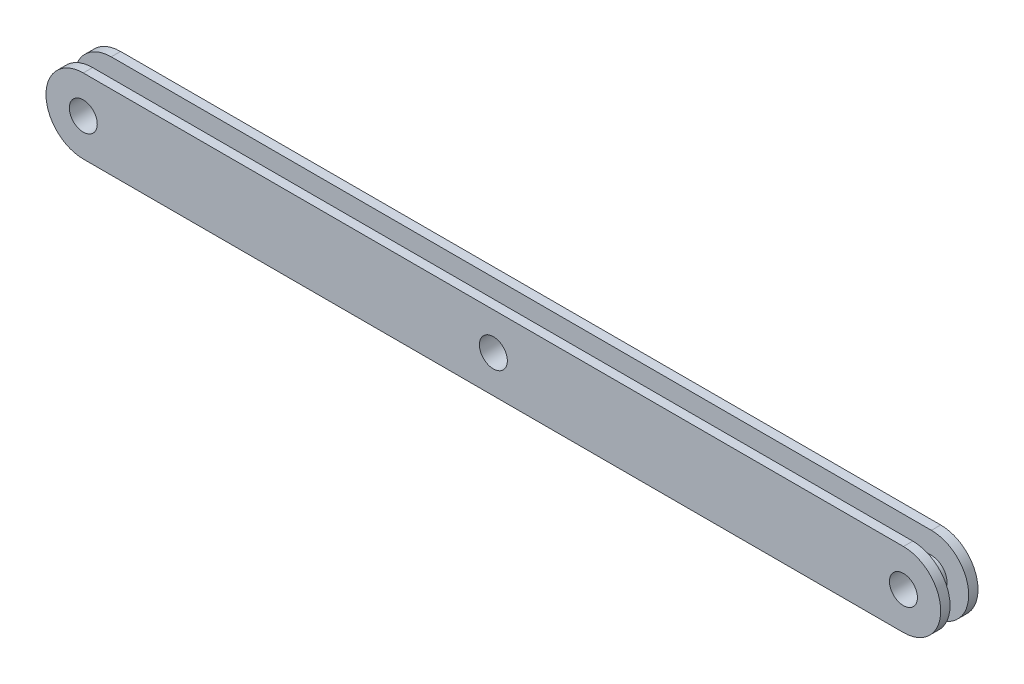
ISO-10303-21;
HEADER;
FILE_DESCRIPTION(('STEP AP214'),'2;1');
FILE_NAME('part.step','',(''),(''),'','','');
FILE_SCHEMA(('AUTOMOTIVE_DESIGN { 1 0 10303 214 1 1 1 1 }'));
ENDSEC;
DATA;
#1=APPLICATION_CONTEXT('core data for automotive mechanical design processes');
#2=APPLICATION_PROTOCOL_DEFINITION('international standard','automotive_design',2000,#1);
#3=PRODUCT_CONTEXT('',#1,'mechanical');
#4=PRODUCT('Part','Part','',(#3));
#5=PRODUCT_RELATED_PRODUCT_CATEGORY('part','',(#4));
#6=PRODUCT_DEFINITION_FORMATION('','',#4);
#7=PRODUCT_DEFINITION_CONTEXT('part definition',#1,'design');
#8=PRODUCT_DEFINITION('design','',#6,#7);
#9=PRODUCT_DEFINITION_SHAPE('','',#8);
#10=(LENGTH_UNIT() NAMED_UNIT(*) SI_UNIT(.MILLI.,.METRE.));
#11=(NAMED_UNIT(*) PLANE_ANGLE_UNIT() SI_UNIT($,.RADIAN.));
#12=(NAMED_UNIT(*) SI_UNIT($,.STERADIAN.) SOLID_ANGLE_UNIT());
#13=UNCERTAINTY_MEASURE_WITH_UNIT(LENGTH_MEASURE(1.E-05),#10,'distance_accuracy_value','');
#14=(GEOMETRIC_REPRESENTATION_CONTEXT(3) GLOBAL_UNCERTAINTY_ASSIGNED_CONTEXT((#13)) GLOBAL_UNIT_ASSIGNED_CONTEXT((#10,
#11,#12)) REPRESENTATION_CONTEXT('',''));
#15=CARTESIAN_POINT('',(0.,0.,0.));
#16=DIRECTION('',(0.,0.,1.));
#17=DIRECTION('',(1.,0.,0.));
#18=AXIS2_PLACEMENT_3D('',#15,#16,#17);
#19=CARTESIAN_POINT('',(0.,0.,-6.35));
#20=DIRECTION('',(0.,-1.,0.));
#21=DIRECTION('',(1.,0.,0.));
#22=AXIS2_PLACEMENT_3D('',#19,#20,#21);
#23=PLANE('',#22);
#24=DIRECTION('',(0.,0.,1.));
#25=VECTOR('',#24,1.);
#26=CARTESIAN_POINT('',(-146.05,0.,-6.35));
#27=LINE('',#26,#25);
#28=CARTESIAN_POINT('',(-146.05,0.,-1.5875));
#29=VERTEX_POINT('',#28);
#30=CARTESIAN_POINT('',(-146.05,0.,0.));
#31=VERTEX_POINT('',#30);
#32=EDGE_CURVE('E138',#29,#31,#27,.T.);
#33=ORIENTED_EDGE('',*,*,#32,.F.);
#34=DIRECTION('',(1.,0.,0.));
#35=VECTOR('',#34,1.);
#36=CARTESIAN_POINT('',(-152.4,0.,-1.5875));
#37=LINE('',#36,#35);
#38=CARTESIAN_POINT('',(-6.35000000000005,0.,-1.5875));
#39=VERTEX_POINT('',#38);
#40=EDGE_CURVE('E226',#29,#39,#37,.T.);
#41=ORIENTED_EDGE('',*,*,#40,.T.);
#42=DIRECTION('',(0.,0.,1.));
#43=VECTOR('',#42,1.);
#44=CARTESIAN_POINT('',(-6.34999999999999,0.,-6.35));
#45=LINE('',#44,#43);
#46=CARTESIAN_POINT('',(-6.34999999999999,0.,0.));
#47=VERTEX_POINT('',#46);
#48=EDGE_CURVE('E290',#39,#47,#45,.T.);
#49=ORIENTED_EDGE('',*,*,#48,.T.);
#50=DIRECTION('',(1.,0.,0.));
#51=VECTOR('',#50,1.);
#52=CARTESIAN_POINT('',(0.,0.,0.));
#53=LINE('',#52,#51);
#54=EDGE_CURVE('E275',#31,#47,#53,.T.);
#55=ORIENTED_EDGE('',*,*,#54,.F.);
#56=EDGE_LOOP('',(#33,#41,#49,#55));
#57=FACE_BOUND('',#56,.T.);
#58=ADVANCED_FACE('F123',(#57),#23,.T.);
#59=CARTESIAN_POINT('',(-6.34999999999999,0.,-6.35));
#60=VERTEX_POINT('',#59);
#61=CARTESIAN_POINT('',(-6.35000000000005,0.,-4.76249999999999));
#62=VERTEX_POINT('',#61);
#63=EDGE_CURVE('E222',#60,#62,#45,.T.);
#64=ORIENTED_EDGE('',*,*,#63,.T.);
#65=DIRECTION('',(1.,0.,0.));
#66=VECTOR('',#65,1.);
#67=CARTESIAN_POINT('',(-152.4,0.,-4.76249999999999));
#68=LINE('',#67,#66);
#69=CARTESIAN_POINT('',(-146.05,0.,-4.76249999999999));
#70=VERTEX_POINT('',#69);
#71=EDGE_CURVE('E214',#70,#62,#68,.T.);
#72=ORIENTED_EDGE('',*,*,#71,.F.);
#73=CARTESIAN_POINT('',(-146.05,0.,-6.35));
#74=VERTEX_POINT('',#73);
#75=EDGE_CURVE('E219',#74,#70,#27,.T.);
#76=ORIENTED_EDGE('',*,*,#75,.F.);
#77=DIRECTION('',(1.,0.,0.));
#78=VECTOR('',#77,1.);
#79=CARTESIAN_POINT('',(0.,0.,-6.35));
#80=LINE('',#79,#78);
#81=EDGE_CURVE('E274',#74,#60,#80,.T.);
#82=ORIENTED_EDGE('',*,*,#81,.T.);
#83=EDGE_LOOP('',(#64,#72,#76,#82));
#84=FACE_BOUND('',#83,.T.);
#85=ADVANCED_FACE('F216',(#84),#23,.T.);
#86=CARTESIAN_POINT('',(-152.4,12.7,-6.35));
#87=DIRECTION('',(0.,1.,0.));
#88=DIRECTION('',(-1.,0.,0.));
#89=AXIS2_PLACEMENT_3D('',#86,#87,#88);
#90=PLANE('',#89);
#91=DIRECTION('',(1.,0.,0.));
#92=VECTOR('',#91,1.);
#93=CARTESIAN_POINT('',(-152.4,12.7,-1.5875));
#94=LINE('',#93,#92);
#95=CARTESIAN_POINT('',(-146.05,12.7,-1.5875));
#96=VERTEX_POINT('',#95);
#97=CARTESIAN_POINT('',(-6.35000000000008,12.7,-1.5875));
#98=VERTEX_POINT('',#97);
#99=EDGE_CURVE('E286',#96,#98,#94,.T.);
#100=ORIENTED_EDGE('',*,*,#99,.F.);
#101=DIRECTION('',(0.,0.,1.));
#102=VECTOR('',#101,1.);
#103=CARTESIAN_POINT('',(-146.05,12.7,-6.35));
#104=LINE('',#103,#102);
#105=CARTESIAN_POINT('',(-146.05,12.7,0.));
#106=VERTEX_POINT('',#105);
#107=EDGE_CURVE('E295',#96,#106,#104,.T.);
#108=ORIENTED_EDGE('',*,*,#107,.T.);
#109=DIRECTION('',(-1.,0.,0.));
#110=VECTOR('',#109,1.);
#111=CARTESIAN_POINT('',(-152.4,12.7,0.));
#112=LINE('',#111,#110);
#113=CARTESIAN_POINT('',(-6.35,12.7,0.));
#114=VERTEX_POINT('',#113);
#115=EDGE_CURVE('E251',#114,#106,#112,.T.);
#116=ORIENTED_EDGE('',*,*,#115,.F.);
#117=DIRECTION('',(0.,0.,1.));
#118=VECTOR('',#117,1.);
#119=CARTESIAN_POINT('',(-6.35,12.7,-6.35));
#120=LINE('',#119,#118);
#121=EDGE_CURVE('E146',#98,#114,#120,.T.);
#122=ORIENTED_EDGE('',*,*,#121,.F.);
#123=EDGE_LOOP('',(#100,#108,#116,#122));
#124=FACE_BOUND('',#123,.T.);
#125=ADVANCED_FACE('F365',(#124),#90,.T.);
#126=CARTESIAN_POINT('',(-6.35,6.34999999999998,-6.35));
#127=DIRECTION('',(0.,0.,1.));
#128=DIRECTION('',(1.,0.,0.));
#129=AXIS2_PLACEMENT_3D('',#126,#127,#128);
#130=CYLINDRICAL_SURFACE('',#129,6.35);
#131=CARTESIAN_POINT('',(-6.35,6.34999999999998,-4.7625));
#132=DIRECTION('',(0.,0.,1.));
#133=DIRECTION('',(1.,0.,0.));
#134=AXIS2_PLACEMENT_3D('',#131,#132,#133);
#135=CIRCLE('',#134,6.35);
#136=CARTESIAN_POINT('',(-6.35000000000008,12.7,-4.76249999999999));
#137=VERTEX_POINT('',#136);
#138=EDGE_CURVE('E12',#62,#137,#135,.T.);
#139=ORIENTED_EDGE('',*,*,#138,.F.);
#140=ORIENTED_EDGE('',*,*,#63,.F.);
#141=CARTESIAN_POINT('',(-6.35,6.34999999999998,-6.35));
#142=DIRECTION('',(0.,0.,1.));
#143=DIRECTION('',(1.,0.,0.));
#144=AXIS2_PLACEMENT_3D('',#141,#142,#143);
#145=CIRCLE('',#144,6.35);
#146=CARTESIAN_POINT('',(-6.35,12.7,-6.35));
#147=VERTEX_POINT('',#146);
#148=EDGE_CURVE('E242',#147,#60,#145,.F.);
#149=ORIENTED_EDGE('',*,*,#148,.F.);
#150=EDGE_CURVE('E257',#147,#137,#120,.T.);
#151=ORIENTED_EDGE('',*,*,#150,.T.);
#152=EDGE_LOOP('',(#139,#140,#149,#151));
#153=FACE_BOUND('',#152,.T.);
#154=ADVANCED_FACE('F383',(#153),#130,.T.);
#155=CARTESIAN_POINT('',(-6.35,6.34999999999998,-1.5875));
#156=DIRECTION('',(0.,0.,-1.));
#157=DIRECTION('',(-1.,0.,0.));
#158=AXIS2_PLACEMENT_3D('',#155,#156,#157);
#159=CIRCLE('',#158,6.35);
#160=EDGE_CURVE('E131',#98,#39,#159,.T.);
#161=ORIENTED_EDGE('',*,*,#160,.F.);
#162=ORIENTED_EDGE('',*,*,#121,.T.);
#163=CARTESIAN_POINT('',(-6.35,6.34999999999998,0.));
#164=DIRECTION('',(0.,0.,1.));
#165=DIRECTION('',(1.,0.,0.));
#166=AXIS2_PLACEMENT_3D('',#163,#164,#165);
#167=CIRCLE('',#166,6.35);
#168=EDGE_CURVE('E240',#114,#47,#167,.F.);
#169=ORIENTED_EDGE('',*,*,#168,.T.);
#170=ORIENTED_EDGE('',*,*,#48,.F.);
#171=EDGE_LOOP('',(#161,#162,#169,#170));
#172=FACE_BOUND('',#171,.T.);
#173=ADVANCED_FACE('F292',(#172),#130,.T.);
#174=CARTESIAN_POINT('',(-146.05,6.34999999999998,-6.35));
#175=DIRECTION('',(0.,0.,1.));
#176=DIRECTION('',(1.,0.,0.));
#177=AXIS2_PLACEMENT_3D('',#174,#175,#176);
#178=CYLINDRICAL_SURFACE('',#177,6.35);
#179=ORIENTED_EDGE('',*,*,#75,.T.);
#180=CARTESIAN_POINT('',(-146.05,6.34999999999998,-4.7625));
#181=DIRECTION('',(0.,0.,1.));
#182=DIRECTION('',(1.,0.,0.));
#183=AXIS2_PLACEMENT_3D('',#180,#181,#182);
#184=CIRCLE('',#183,6.35);
#185=CARTESIAN_POINT('',(-146.05,12.7,-4.76249999999999));
#186=VERTEX_POINT('',#185);
#187=EDGE_CURVE('E229',#70,#186,#184,.F.);
#188=ORIENTED_EDGE('',*,*,#187,.T.);
#189=CARTESIAN_POINT('',(-146.05,12.7,-6.35));
#190=VERTEX_POINT('',#189);
#191=EDGE_CURVE('E293',#190,#186,#104,.T.);
#192=ORIENTED_EDGE('',*,*,#191,.F.);
#193=CARTESIAN_POINT('',(-146.05,6.34999999999998,-6.35));
#194=DIRECTION('',(0.,0.,1.));
#195=DIRECTION('',(1.,0.,0.));
#196=AXIS2_PLACEMENT_3D('',#193,#194,#195);
#197=CIRCLE('',#196,6.35);
#198=EDGE_CURVE('E239',#190,#74,#197,.T.);
#199=ORIENTED_EDGE('',*,*,#198,.T.);
#200=EDGE_LOOP('',(#179,#188,#192,#199));
#201=FACE_BOUND('',#200,.T.);
#202=ADVANCED_FACE('F238',(#201),#178,.T.);
#203=ORIENTED_EDGE('',*,*,#107,.F.);
#204=CARTESIAN_POINT('',(-146.05,6.34999999999998,-1.5875));
#205=DIRECTION('',(0.,0.,-1.));
#206=DIRECTION('',(-1.,0.,0.));
#207=AXIS2_PLACEMENT_3D('',#204,#205,#206);
#208=CIRCLE('',#207,6.35);
#209=EDGE_CURVE('E236',#96,#29,#208,.F.);
#210=ORIENTED_EDGE('',*,*,#209,.T.);
#211=ORIENTED_EDGE('',*,*,#32,.T.);
#212=CARTESIAN_POINT('',(-146.05,6.34999999999998,0.));
#213=DIRECTION('',(0.,0.,1.));
#214=DIRECTION('',(1.,0.,0.));
#215=AXIS2_PLACEMENT_3D('',#212,#213,#214);
#216=CIRCLE('',#215,6.35);
#217=EDGE_CURVE('E246',#106,#31,#216,.T.);
#218=ORIENTED_EDGE('',*,*,#217,.F.);
#219=EDGE_LOOP('',(#203,#210,#211,#218));
#220=FACE_BOUND('',#219,.T.);
#221=ADVANCED_FACE('F304',(#220),#178,.T.);
#222=DIRECTION('',(1.,0.,0.));
#223=VECTOR('',#222,1.);
#224=CARTESIAN_POINT('',(-152.4,12.7,-4.76249999999999));
#225=LINE('',#224,#223);
#226=EDGE_CURVE('E232',#186,#137,#225,.T.);
#227=ORIENTED_EDGE('',*,*,#226,.T.);
#228=ORIENTED_EDGE('',*,*,#150,.F.);
#229=DIRECTION('',(-1.,0.,0.));
#230=VECTOR('',#229,1.);
#231=CARTESIAN_POINT('',(-152.4,12.7,-6.35));
#232=LINE('',#231,#230);
#233=EDGE_CURVE('E271',#147,#190,#232,.T.);
#234=ORIENTED_EDGE('',*,*,#233,.T.);
#235=ORIENTED_EDGE('',*,*,#191,.T.);
#236=EDGE_LOOP('',(#227,#228,#234,#235));
#237=FACE_BOUND('',#236,.T.);
#238=ADVANCED_FACE('F125',(#237),#90,.T.);
#239=CARTESIAN_POINT('',(0.,0.,-6.35));
#240=DIRECTION('',(0.,0.,-1.));
#241=DIRECTION('',(-1.,0.,0.));
#242=AXIS2_PLACEMENT_3D('',#239,#240,#241);
#243=PLANE('',#242);
#244=ORIENTED_EDGE('',*,*,#148,.T.);
#245=ORIENTED_EDGE('',*,*,#81,.F.);
#246=ORIENTED_EDGE('',*,*,#198,.F.);
#247=ORIENTED_EDGE('',*,*,#233,.F.);
#248=EDGE_LOOP('',(#244,#245,#246,#247));
#249=FACE_BOUND('',#248,.T.);
#250=CARTESIAN_POINT('',(-76.2,6.34999999999998,-6.35));
#251=DIRECTION('',(0.,0.,1.));
#252=DIRECTION('',(1.,0.,0.));
#253=AXIS2_PLACEMENT_3D('',#250,#251,#252);
#254=CIRCLE('',#253,2.38125000000001);
#255=CARTESIAN_POINT('',(-73.81875,6.34999999999998,-6.35));
#256=VERTEX_POINT('',#255);
#257=EDGE_CURVE('E255',#256,#256,#254,.T.);
#258=ORIENTED_EDGE('',*,*,#257,.T.);
#259=EDGE_LOOP('',(#258));
#260=FACE_BOUND('',#259,.T.);
#261=CARTESIAN_POINT('',(-6.35,6.34999999999998,-6.35));
#262=DIRECTION('',(0.,0.,1.));
#263=DIRECTION('',(1.,0.,0.));
#264=AXIS2_PLACEMENT_3D('',#261,#262,#263);
#265=CIRCLE('',#264,2.38125);
#266=CARTESIAN_POINT('',(-3.96875,6.34999999999998,-6.35));
#267=VERTEX_POINT('',#266);
#268=EDGE_CURVE('E266',#267,#267,#265,.T.);
#269=ORIENTED_EDGE('',*,*,#268,.T.);
#270=EDGE_LOOP('',(#269));
#271=FACE_BOUND('',#270,.T.);
#272=CARTESIAN_POINT('',(-146.05,6.34999999999998,-6.35));
#273=DIRECTION('',(0.,0.,1.));
#274=DIRECTION('',(1.,0.,0.));
#275=AXIS2_PLACEMENT_3D('',#272,#273,#274);
#276=CIRCLE('',#275,2.38125000000001);
#277=CARTESIAN_POINT('',(-143.66875,6.34999999999998,-6.35));
#278=VERTEX_POINT('',#277);
#279=EDGE_CURVE('E248',#278,#278,#276,.T.);
#280=ORIENTED_EDGE('',*,*,#279,.T.);
#281=EDGE_LOOP('',(#280));
#282=FACE_BOUND('',#281,.T.);
#283=ADVANCED_FACE('F370',(#249,#260,#271,#282),#243,.T.);
#284=CARTESIAN_POINT('',(0.,0.,0.));
#285=DIRECTION('',(0.,0.,-1.));
#286=DIRECTION('',(-1.,0.,0.));
#287=AXIS2_PLACEMENT_3D('',#284,#285,#286);
#288=PLANE('',#287);
#289=CARTESIAN_POINT('',(-76.2,6.34999999999998,0.));
#290=DIRECTION('',(0.,0.,1.));
#291=DIRECTION('',(1.,0.,0.));
#292=AXIS2_PLACEMENT_3D('',#289,#290,#291);
#293=CIRCLE('',#292,2.38125000000001);
#294=CARTESIAN_POINT('',(-73.81875,6.34999999999998,0.));
#295=VERTEX_POINT('',#294);
#296=EDGE_CURVE('E263',#295,#295,#293,.T.);
#297=ORIENTED_EDGE('',*,*,#296,.F.);
#298=EDGE_LOOP('',(#297));
#299=FACE_BOUND('',#298,.T.);
#300=CARTESIAN_POINT('',(-6.35,6.34999999999998,0.));
#301=DIRECTION('',(0.,0.,1.));
#302=DIRECTION('',(1.,0.,0.));
#303=AXIS2_PLACEMENT_3D('',#300,#301,#302);
#304=CIRCLE('',#303,2.38125);
#305=CARTESIAN_POINT('',(-3.96875,6.34999999999998,0.));
#306=VERTEX_POINT('',#305);
#307=EDGE_CURVE('E260',#306,#306,#304,.T.);
#308=ORIENTED_EDGE('',*,*,#307,.F.);
#309=EDGE_LOOP('',(#308));
#310=FACE_BOUND('',#309,.T.);
#311=CARTESIAN_POINT('',(-146.05,6.34999999999998,0.));
#312=DIRECTION('',(0.,0.,1.));
#313=DIRECTION('',(1.,0.,0.));
#314=AXIS2_PLACEMENT_3D('',#311,#312,#313);
#315=CIRCLE('',#314,2.38125000000001);
#316=CARTESIAN_POINT('',(-143.66875,6.34999999999998,0.));
#317=VERTEX_POINT('',#316);
#318=EDGE_CURVE('E252',#317,#317,#315,.T.);
#319=ORIENTED_EDGE('',*,*,#318,.F.);
#320=EDGE_LOOP('',(#319));
#321=FACE_BOUND('',#320,.T.);
#322=ORIENTED_EDGE('',*,*,#54,.T.);
#323=ORIENTED_EDGE('',*,*,#168,.F.);
#324=ORIENTED_EDGE('',*,*,#115,.T.);
#325=ORIENTED_EDGE('',*,*,#217,.T.);
#326=EDGE_LOOP('',(#322,#323,#324,#325));
#327=FACE_BOUND('',#326,.T.);
#328=ADVANCED_FACE('F301',(#299,#310,#321,#327),#288,.F.);
#329=CARTESIAN_POINT('',(-146.05,6.34999999999998,-6.35));
#330=DIRECTION('',(0.,0.,1.));
#331=DIRECTION('',(1.,0.,0.));
#332=AXIS2_PLACEMENT_3D('',#329,#330,#331);
#333=CYLINDRICAL_SURFACE('',#332,2.38125000000001);
#334=ORIENTED_EDGE('',*,*,#279,.F.);
#335=EDGE_LOOP('',(#334));
#336=FACE_BOUND('',#335,.T.);
#337=ORIENTED_EDGE('',*,*,#318,.T.);
#338=EDGE_LOOP('',(#337));
#339=FACE_BOUND('',#338,.T.);
#340=ADVANCED_FACE('F369',(#336,#339),#333,.F.);
#341=CARTESIAN_POINT('',(-6.35,6.34999999999998,-6.35));
#342=DIRECTION('',(0.,0.,1.));
#343=DIRECTION('',(1.,0.,0.));
#344=AXIS2_PLACEMENT_3D('',#341,#342,#343);
#345=CYLINDRICAL_SURFACE('',#344,2.38125);
#346=ORIENTED_EDGE('',*,*,#268,.F.);
#347=EDGE_LOOP('',(#346));
#348=FACE_BOUND('',#347,.T.);
#349=ORIENTED_EDGE('',*,*,#307,.T.);
#350=EDGE_LOOP('',(#349));
#351=FACE_BOUND('',#350,.T.);
#352=ADVANCED_FACE('F375',(#348,#351),#345,.F.);
#353=CARTESIAN_POINT('',(-76.2,6.34999999999998,-6.35));
#354=DIRECTION('',(0.,0.,1.));
#355=DIRECTION('',(1.,0.,0.));
#356=AXIS2_PLACEMENT_3D('',#353,#354,#355);
#357=CYLINDRICAL_SURFACE('',#356,2.38125000000001);
#358=ORIENTED_EDGE('',*,*,#257,.F.);
#359=EDGE_LOOP('',(#358));
#360=FACE_BOUND('',#359,.T.);
#361=ORIENTED_EDGE('',*,*,#296,.T.);
#362=EDGE_LOOP('',(#361));
#363=FACE_BOUND('',#362,.T.);
#364=ADVANCED_FACE('F378',(#360,#363),#357,.F.);
#365=CARTESIAN_POINT('',(-146.050000000001,152.4,-4.7625));
#366=DIRECTION('',(0.,0.,1.));
#367=DIRECTION('',(1.,0.,0.));
#368=AXIS2_PLACEMENT_3D('',#365,#366,#367);
#369=PLANE('',#368);
#370=DIRECTION('',(1.,0.,0.));
#371=VECTOR('',#370,1.);
#372=CARTESIAN_POINT('',(-152.4,3.68299999999997,-4.76249999999999));
#373=LINE('',#372,#371);
#374=CARTESIAN_POINT('',(-146.05,3.68299999999997,-4.76249999999999));
#375=VERTEX_POINT('',#374);
#376=CARTESIAN_POINT('',(-6.34999999999999,3.68299999999997,-4.7625));
#377=VERTEX_POINT('',#376);
#378=EDGE_CURVE('E225',#375,#377,#373,.T.);
#379=ORIENTED_EDGE('',*,*,#378,.F.);
#380=CARTESIAN_POINT('',(-146.05,6.34999999999999,-4.7625));
#381=DIRECTION('',(0.,0.,-1.));
#382=DIRECTION('',(-1.,0.,0.));
#383=AXIS2_PLACEMENT_3D('',#380,#381,#382);
#384=CIRCLE('',#383,2.66700000000001);
#385=CARTESIAN_POINT('',(-146.05,9.017,-4.76249999999999));
#386=VERTEX_POINT('',#385);
#387=EDGE_CURVE('E298',#375,#386,#384,.T.);
#388=ORIENTED_EDGE('',*,*,#387,.T.);
#389=DIRECTION('',(1.,0.,0.));
#390=VECTOR('',#389,1.);
#391=CARTESIAN_POINT('',(-152.4,9.017,-4.76249999999999));
#392=LINE('',#391,#390);
#393=CARTESIAN_POINT('',(-6.35000000000005,9.017,-4.76249999999999));
#394=VERTEX_POINT('',#393);
#395=EDGE_CURVE('E335',#386,#394,#392,.T.);
#396=ORIENTED_EDGE('',*,*,#395,.T.);
#397=CARTESIAN_POINT('',(-6.34999999999999,6.34999999999999,-4.7625));
#398=DIRECTION('',(0.,0.,1.));
#399=DIRECTION('',(1.,0.,0.));
#400=AXIS2_PLACEMENT_3D('',#397,#398,#399);
#401=CIRCLE('',#400,2.66700000000001);
#402=EDGE_CURVE('E322',#377,#394,#401,.T.);
#403=ORIENTED_EDGE('',*,*,#402,.F.);
#404=EDGE_LOOP('',(#379,#388,#396,#403));
#405=FACE_BOUND('',#404,.T.);
#406=ORIENTED_EDGE('',*,*,#138,.T.);
#407=ORIENTED_EDGE('',*,*,#226,.F.);
#408=ORIENTED_EDGE('',*,*,#187,.F.);
#409=ORIENTED_EDGE('',*,*,#71,.T.);
#410=EDGE_LOOP('',(#406,#407,#408,#409));
#411=FACE_BOUND('',#410,.T.);
#412=ADVANCED_FACE('F230',(#405,#411),#369,.T.);
#413=CARTESIAN_POINT('',(-146.050000000001,152.4,-1.5875));
#414=DIRECTION('',(0.,0.,-1.));
#415=DIRECTION('',(-1.,0.,0.));
#416=AXIS2_PLACEMENT_3D('',#413,#414,#415);
#417=PLANE('',#416);
#418=DIRECTION('',(1.,0.,0.));
#419=VECTOR('',#418,1.);
#420=CARTESIAN_POINT('',(-152.4,3.68299999999997,-1.5875));
#421=LINE('',#420,#419);
#422=CARTESIAN_POINT('',(-146.05,3.68299999999997,-1.5875));
#423=VERTEX_POINT('',#422);
#424=CARTESIAN_POINT('',(-6.35000000000005,3.68299999999999,-1.5875));
#425=VERTEX_POINT('',#424);
#426=EDGE_CURVE('E336',#423,#425,#421,.T.);
#427=ORIENTED_EDGE('',*,*,#426,.T.);
#428=CARTESIAN_POINT('',(-6.34999999999999,6.34999999999999,-1.5875));
#429=DIRECTION('',(0.,0.,1.));
#430=DIRECTION('',(1.,0.,0.));
#431=AXIS2_PLACEMENT_3D('',#428,#429,#430);
#432=CIRCLE('',#431,2.66700000000001);
#433=CARTESIAN_POINT('',(-6.34999999999999,9.017,-1.5875));
#434=VERTEX_POINT('',#433);
#435=EDGE_CURVE('E325',#425,#434,#432,.T.);
#436=ORIENTED_EDGE('',*,*,#435,.T.);
#437=DIRECTION('',(1.,0.,0.));
#438=VECTOR('',#437,1.);
#439=CARTESIAN_POINT('',(-152.4,9.017,-1.5875));
#440=LINE('',#439,#438);
#441=CARTESIAN_POINT('',(-146.05,9.017,-1.5875));
#442=VERTEX_POINT('',#441);
#443=EDGE_CURVE('E333',#442,#434,#440,.T.);
#444=ORIENTED_EDGE('',*,*,#443,.F.);
#445=CARTESIAN_POINT('',(-146.05,6.34999999999999,-1.5875));
#446=DIRECTION('',(0.,0.,-1.));
#447=DIRECTION('',(-1.,0.,0.));
#448=AXIS2_PLACEMENT_3D('',#445,#446,#447);
#449=CIRCLE('',#448,2.66700000000001);
#450=EDGE_CURVE('E307',#423,#442,#449,.T.);
#451=ORIENTED_EDGE('',*,*,#450,.F.);
#452=EDGE_LOOP('',(#427,#436,#444,#451));
#453=FACE_BOUND('',#452,.T.);
#454=ORIENTED_EDGE('',*,*,#40,.F.);
#455=ORIENTED_EDGE('',*,*,#209,.F.);
#456=ORIENTED_EDGE('',*,*,#99,.T.);
#457=ORIENTED_EDGE('',*,*,#160,.T.);
#458=EDGE_LOOP('',(#454,#455,#456,#457));
#459=FACE_BOUND('',#458,.T.);
#460=ADVANCED_FACE('F284',(#453,#459),#417,.T.);
#461=CARTESIAN_POINT('',(-146.05,6.34999999999999,-6.35));
#462=DIRECTION('',(0.,0.,-1.));
#463=DIRECTION('',(-1.,0.,0.));
#464=AXIS2_PLACEMENT_3D('',#461,#462,#463);
#465=CYLINDRICAL_SURFACE('',#464,2.66700000000001);
#466=DIRECTION('',(0.,0.,1.));
#467=VECTOR('',#466,1.);
#468=CARTESIAN_POINT('',(-146.05,3.68299999999997,0.));
#469=LINE('',#468,#467);
#470=EDGE_CURVE('E314',#375,#423,#469,.T.);
#471=ORIENTED_EDGE('',*,*,#470,.T.);
#472=ORIENTED_EDGE('',*,*,#450,.T.);
#473=DIRECTION('',(0.,0.,1.));
#474=VECTOR('',#473,1.);
#475=CARTESIAN_POINT('',(-146.05,9.017,0.));
#476=LINE('',#475,#474);
#477=EDGE_CURVE('E318',#386,#442,#476,.T.);
#478=ORIENTED_EDGE('',*,*,#477,.F.);
#479=ORIENTED_EDGE('',*,*,#387,.F.);
#480=EDGE_LOOP('',(#471,#472,#478,#479));
#481=FACE_BOUND('',#480,.T.);
#482=ADVANCED_FACE('F352',(#481),#465,.T.);
#483=CARTESIAN_POINT('',(-6.34999999999999,6.34999999999999,-6.35));
#484=DIRECTION('',(0.,0.,-1.));
#485=DIRECTION('',(1.,0.,0.));
#486=AXIS2_PLACEMENT_3D('',#483,#484,#485);
#487=CYLINDRICAL_SURFACE('',#486,2.66700000000001);
#488=DIRECTION('',(0.,0.,1.));
#489=VECTOR('',#488,1.);
#490=CARTESIAN_POINT('',(-6.34999999999999,3.68299999999997,0.));
#491=LINE('',#490,#489);
#492=EDGE_CURVE('E328',#377,#425,#491,.T.);
#493=ORIENTED_EDGE('',*,*,#492,.F.);
#494=ORIENTED_EDGE('',*,*,#402,.T.);
#495=DIRECTION('',(0.,0.,1.));
#496=VECTOR('',#495,1.);
#497=CARTESIAN_POINT('',(-6.34999999999999,9.017,0.));
#498=LINE('',#497,#496);
#499=EDGE_CURVE('E330',#394,#434,#498,.T.);
#500=ORIENTED_EDGE('',*,*,#499,.T.);
#501=ORIENTED_EDGE('',*,*,#435,.F.);
#502=EDGE_LOOP('',(#493,#494,#500,#501));
#503=FACE_BOUND('',#502,.T.);
#504=ADVANCED_FACE('F348',(#503),#487,.T.);
#505=CARTESIAN_POINT('',(-152.4,9.017,-1.5875));
#506=DIRECTION('',(0.,-1.,0.));
#507=DIRECTION('',(0.,0.,-1.));
#508=AXIS2_PLACEMENT_3D('',#505,#506,#507);
#509=PLANE('',#508);
#510=ORIENTED_EDGE('',*,*,#477,.T.);
#511=ORIENTED_EDGE('',*,*,#443,.T.);
#512=ORIENTED_EDGE('',*,*,#499,.F.);
#513=ORIENTED_EDGE('',*,*,#395,.F.);
#514=EDGE_LOOP('',(#510,#511,#512,#513));
#515=FACE_BOUND('',#514,.T.);
#516=ADVANCED_FACE('F351',(#515),#509,.F.);
#517=CARTESIAN_POINT('',(-152.4,3.68299999999997,-1.5875));
#518=DIRECTION('',(0.,-1.,0.));
#519=DIRECTION('',(1.,0.,0.));
#520=AXIS2_PLACEMENT_3D('',#517,#518,#519);
#521=PLANE('',#520);
#522=ORIENTED_EDGE('',*,*,#378,.T.);
#523=ORIENTED_EDGE('',*,*,#492,.T.);
#524=ORIENTED_EDGE('',*,*,#426,.F.);
#525=ORIENTED_EDGE('',*,*,#470,.F.);
#526=EDGE_LOOP('',(#522,#523,#524,#525));
#527=FACE_BOUND('',#526,.T.);
#528=ADVANCED_FACE('F353',(#527),#521,.T.);
#529=CLOSED_SHELL('',(#58,#85,#125,#154,#173,#202,#221,#238,#283,#328,#340,#352,#364,#412,#460,
#482,#504,#516,#528));
#530=MANIFOLD_SOLID_BREP('B2',#529);
#531=ADVANCED_BREP_SHAPE_REPRESENTATION('',(#18,#530),#14);
#532=SHAPE_DEFINITION_REPRESENTATION(#9,#531);
ENDSEC;
END-ISO-10303-21;
